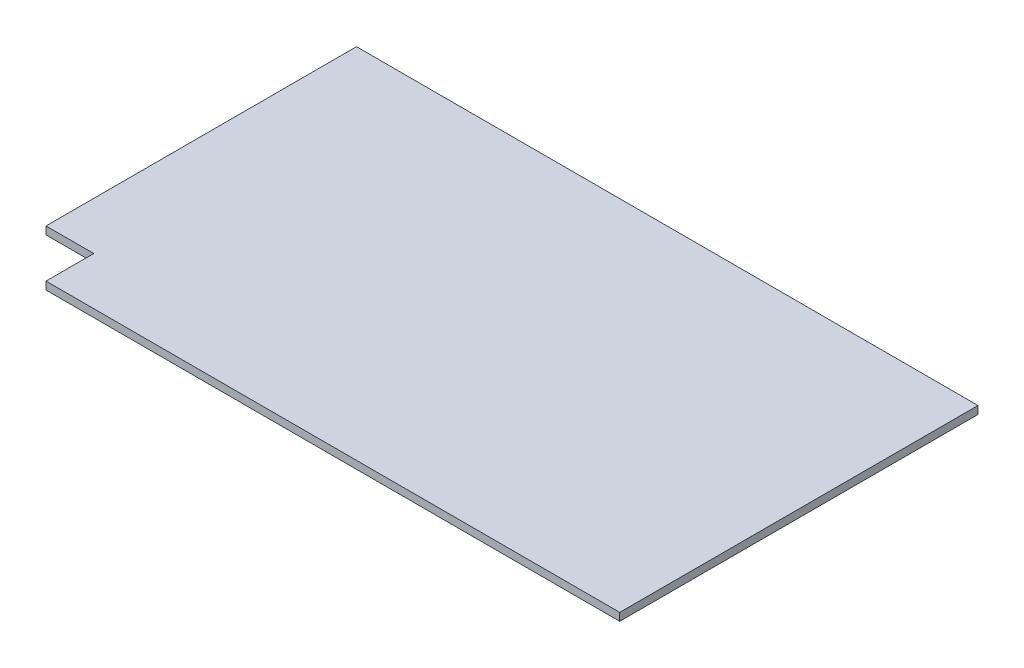
ISO-10303-21;
HEADER;
FILE_DESCRIPTION(('STEP AP214'),'2;1');
FILE_NAME('part.step','',(''),(''),'','','');
FILE_SCHEMA(('AUTOMOTIVE_DESIGN { 1 0 10303 214 1 1 1 1 }'));
ENDSEC;
DATA;
#1=APPLICATION_CONTEXT('core data for automotive mechanical design processes');
#2=APPLICATION_PROTOCOL_DEFINITION('international standard','automotive_design',2000,#1);
#3=PRODUCT_CONTEXT('',#1,'mechanical');
#4=PRODUCT('Part','Part','',(#3));
#5=PRODUCT_RELATED_PRODUCT_CATEGORY('part','',(#4));
#6=PRODUCT_DEFINITION_FORMATION('','',#4);
#7=PRODUCT_DEFINITION_CONTEXT('part definition',#1,'design');
#8=PRODUCT_DEFINITION('design','',#6,#7);
#9=PRODUCT_DEFINITION_SHAPE('','',#8);
#10=(LENGTH_UNIT() NAMED_UNIT(*) SI_UNIT(.MILLI.,.METRE.));
#11=(NAMED_UNIT(*) PLANE_ANGLE_UNIT() SI_UNIT($,.RADIAN.));
#12=(NAMED_UNIT(*) SI_UNIT($,.STERADIAN.) SOLID_ANGLE_UNIT());
#13=UNCERTAINTY_MEASURE_WITH_UNIT(LENGTH_MEASURE(1.E-05),#10,'distance_accuracy_value','');
#14=(GEOMETRIC_REPRESENTATION_CONTEXT(3) GLOBAL_UNCERTAINTY_ASSIGNED_CONTEXT((#13)) GLOBAL_UNIT_ASSIGNED_CONTEXT((#10,
#11,#12)) REPRESENTATION_CONTEXT('',''));
#15=CARTESIAN_POINT('',(0.,0.,0.));
#16=DIRECTION('',(0.,0.,1.));
#17=DIRECTION('',(1.,0.,0.));
#18=AXIS2_PLACEMENT_3D('',#15,#16,#17);
#19=CARTESIAN_POINT('',(-750.,15.,1250.));
#20=DIRECTION('',(1.,0.,0.));
#21=DIRECTION('',(0.,0.,-1.));
#22=AXIS2_PLACEMENT_3D('',#19,#20,#21);
#23=PLANE('',#22);
#24=DIRECTION('',(0.,0.,1.));
#25=VECTOR('',#24,1.);
#26=CARTESIAN_POINT('',(-750.,0.,1250.));
#27=LINE('',#26,#25);
#28=CARTESIAN_POINT('',(-750.,0.,560.));
#29=VERTEX_POINT('',#28);
#30=CARTESIAN_POINT('',(-750.,0.,1158.));
#31=VERTEX_POINT('',#30);
#32=EDGE_CURVE('E108',#29,#31,#27,.T.);
#33=ORIENTED_EDGE('',*,*,#32,.T.);
#34=DIRECTION('',(0.,1.,0.));
#35=VECTOR('',#34,1.);
#36=CARTESIAN_POINT('',(-750.,0.,1158.));
#37=LINE('',#36,#35);
#38=CARTESIAN_POINT('',(-750.,15.,1158.));
#39=VERTEX_POINT('',#38);
#40=EDGE_CURVE('E129',#31,#39,#37,.T.);
#41=ORIENTED_EDGE('',*,*,#40,.T.);
#42=DIRECTION('',(0.,0.,1.));
#43=VECTOR('',#42,1.);
#44=CARTESIAN_POINT('',(-750.,15.,1250.));
#45=LINE('',#44,#43);
#46=CARTESIAN_POINT('',(-750.,15.,560.));
#47=VERTEX_POINT('',#46);
#48=EDGE_CURVE('E42',#47,#39,#45,.T.);
#49=ORIENTED_EDGE('',*,*,#48,.F.);
#50=DIRECTION('',(0.,1.,0.));
#51=VECTOR('',#50,1.);
#52=CARTESIAN_POINT('',(-750.,0.,560.));
#53=LINE('',#52,#51);
#54=EDGE_CURVE('E124',#29,#47,#53,.T.);
#55=ORIENTED_EDGE('',*,*,#54,.F.);
#56=EDGE_LOOP('',(#33,#41,#49,#55));
#57=FACE_BOUND('',#56,.T.);
#58=ADVANCED_FACE('F34',(#57),#23,.F.);
#59=CARTESIAN_POINT('',(-750.,15.,1250.));
#60=DIRECTION('',(0.,0.,-1.));
#61=DIRECTION('',(-1.,0.,0.));
#62=AXIS2_PLACEMENT_3D('',#59,#60,#61);
#63=PLANE('',#62);
#64=DIRECTION('',(1.,0.,0.));
#65=VECTOR('',#64,1.);
#66=CARTESIAN_POINT('',(-750.,15.,1250.));
#67=LINE('',#66,#65);
#68=CARTESIAN_POINT('',(-658.,15.,1250.));
#69=VERTEX_POINT('',#68);
#70=CARTESIAN_POINT('',(447.,15.,1250.));
#71=VERTEX_POINT('',#70);
#72=EDGE_CURVE('E11',#69,#71,#67,.T.);
#73=ORIENTED_EDGE('',*,*,#72,.F.);
#74=DIRECTION('',(0.,1.,0.));
#75=VECTOR('',#74,1.);
#76=CARTESIAN_POINT('',(-658.,0.,1250.));
#77=LINE('',#76,#75);
#78=CARTESIAN_POINT('',(-658.,0.,1250.));
#79=VERTEX_POINT('',#78);
#80=EDGE_CURVE('E90',#79,#69,#77,.T.);
#81=ORIENTED_EDGE('',*,*,#80,.F.);
#82=DIRECTION('',(1.,0.,0.));
#83=VECTOR('',#82,1.);
#84=CARTESIAN_POINT('',(-750.,0.,1250.));
#85=LINE('',#84,#83);
#86=CARTESIAN_POINT('',(447.,0.,1250.));
#87=VERTEX_POINT('',#86);
#88=EDGE_CURVE('E37',#79,#87,#85,.T.);
#89=ORIENTED_EDGE('',*,*,#88,.T.);
#90=DIRECTION('',(0.,1.,0.));
#91=VECTOR('',#90,1.);
#92=CARTESIAN_POINT('',(447.,0.,1250.));
#93=LINE('',#92,#91);
#94=EDGE_CURVE('E112',#87,#71,#93,.T.);
#95=ORIENTED_EDGE('',*,*,#94,.T.);
#96=EDGE_LOOP('',(#73,#81,#89,#95));
#97=FACE_BOUND('',#96,.T.);
#98=ADVANCED_FACE('F99',(#97),#63,.F.);
#99=CARTESIAN_POINT('',(0.,15.,0.));
#100=DIRECTION('',(0.,-1.,0.));
#101=DIRECTION('',(0.,0.,-1.));
#102=AXIS2_PLACEMENT_3D('',#99,#100,#101);
#103=PLANE('',#102);
#104=ORIENTED_EDGE('',*,*,#48,.T.);
#105=DIRECTION('',(-1.,0.,0.));
#106=VECTOR('',#105,1.);
#107=CARTESIAN_POINT('',(-750.,15.,1158.));
#108=LINE('',#107,#106);
#109=CARTESIAN_POINT('',(-658.,15.,1158.));
#110=VERTEX_POINT('',#109);
#111=EDGE_CURVE('E95',#110,#39,#108,.T.);
#112=ORIENTED_EDGE('',*,*,#111,.F.);
#113=DIRECTION('',(0.,0.,-1.));
#114=VECTOR('',#113,1.);
#115=CARTESIAN_POINT('',(-658.,15.,1250.));
#116=LINE('',#115,#114);
#117=EDGE_CURVE('E134',#69,#110,#116,.T.);
#118=ORIENTED_EDGE('',*,*,#117,.F.);
#119=ORIENTED_EDGE('',*,*,#72,.T.);
#120=DIRECTION('',(0.,0.,1.));
#121=VECTOR('',#120,1.);
#122=CARTESIAN_POINT('',(447.,15.,-1150.));
#123=LINE('',#122,#121);
#124=CARTESIAN_POINT('',(447.,15.,560.000000000001));
#125=VERTEX_POINT('',#124);
#126=EDGE_CURVE('E119',#125,#71,#123,.T.);
#127=ORIENTED_EDGE('',*,*,#126,.F.);
#128=DIRECTION('',(1.,0.,0.));
#129=VECTOR('',#128,1.);
#130=CARTESIAN_POINT('',(-750.,15.,560.));
#131=LINE('',#130,#129);
#132=EDGE_CURVE('E58',#47,#125,#131,.T.);
#133=ORIENTED_EDGE('',*,*,#132,.F.);
#134=EDGE_LOOP('',(#104,#112,#118,#119,#127,#133));
#135=FACE_BOUND('',#134,.T.);
#136=ADVANCED_FACE('F140',(#135),#103,.F.);
#137=CARTESIAN_POINT('',(0.,0.,0.));
#138=DIRECTION('',(0.,-1.,0.));
#139=DIRECTION('',(0.,0.,-1.));
#140=AXIS2_PLACEMENT_3D('',#137,#138,#139);
#141=PLANE('',#140);
#142=DIRECTION('',(-1.,0.,0.));
#143=VECTOR('',#142,1.);
#144=CARTESIAN_POINT('',(-750.,0.,1158.));
#145=LINE('',#144,#143);
#146=CARTESIAN_POINT('',(-658.,0.,1158.));
#147=VERTEX_POINT('',#146);
#148=EDGE_CURVE('E50',#147,#31,#145,.T.);
#149=ORIENTED_EDGE('',*,*,#148,.T.);
#150=ORIENTED_EDGE('',*,*,#32,.F.);
#151=DIRECTION('',(1.,0.,0.));
#152=VECTOR('',#151,1.);
#153=CARTESIAN_POINT('',(-750.,0.,560.));
#154=LINE('',#153,#152);
#155=CARTESIAN_POINT('',(447.,0.,560.));
#156=VERTEX_POINT('',#155);
#157=EDGE_CURVE('E126',#29,#156,#154,.T.);
#158=ORIENTED_EDGE('',*,*,#157,.T.);
#159=DIRECTION('',(0.,0.,1.));
#160=VECTOR('',#159,1.);
#161=CARTESIAN_POINT('',(447.,0.,-1150.));
#162=LINE('',#161,#160);
#163=EDGE_CURVE('E106',#156,#87,#162,.T.);
#164=ORIENTED_EDGE('',*,*,#163,.T.);
#165=ORIENTED_EDGE('',*,*,#88,.F.);
#166=DIRECTION('',(0.,0.,-1.));
#167=VECTOR('',#166,1.);
#168=CARTESIAN_POINT('',(-658.,0.,1250.));
#169=LINE('',#168,#167);
#170=EDGE_CURVE('E86',#79,#147,#169,.T.);
#171=ORIENTED_EDGE('',*,*,#170,.T.);
#172=EDGE_LOOP('',(#149,#150,#158,#164,#165,#171));
#173=FACE_BOUND('',#172,.T.);
#174=ADVANCED_FACE('F103',(#173),#141,.T.);
#175=CARTESIAN_POINT('',(447.,0.,-1150.));
#176=DIRECTION('',(-1.,0.,0.));
#177=DIRECTION('',(0.,0.,1.));
#178=AXIS2_PLACEMENT_3D('',#175,#176,#177);
#179=PLANE('',#178);
#180=ORIENTED_EDGE('',*,*,#163,.F.);
#181=DIRECTION('',(0.,1.,0.));
#182=VECTOR('',#181,1.);
#183=CARTESIAN_POINT('',(447.,0.,560.));
#184=LINE('',#183,#182);
#185=EDGE_CURVE('E122',#156,#125,#184,.T.);
#186=ORIENTED_EDGE('',*,*,#185,.T.);
#187=ORIENTED_EDGE('',*,*,#126,.T.);
#188=ORIENTED_EDGE('',*,*,#94,.F.);
#189=EDGE_LOOP('',(#180,#186,#187,#188));
#190=FACE_BOUND('',#189,.T.);
#191=ADVANCED_FACE('F137',(#190),#179,.F.);
#192=CARTESIAN_POINT('',(-750.,0.,560.));
#193=DIRECTION('',(0.,0.,1.));
#194=DIRECTION('',(1.,0.,0.));
#195=AXIS2_PLACEMENT_3D('',#192,#193,#194);
#196=PLANE('',#195);
#197=ORIENTED_EDGE('',*,*,#132,.T.);
#198=ORIENTED_EDGE('',*,*,#185,.F.);
#199=ORIENTED_EDGE('',*,*,#157,.F.);
#200=ORIENTED_EDGE('',*,*,#54,.T.);
#201=EDGE_LOOP('',(#197,#198,#199,#200));
#202=FACE_BOUND('',#201,.T.);
#203=ADVANCED_FACE('F144',(#202),#196,.F.);
#204=CARTESIAN_POINT('',(-750.,0.,1158.));
#205=DIRECTION('',(0.,0.,-1.));
#206=DIRECTION('',(-1.,0.,0.));
#207=AXIS2_PLACEMENT_3D('',#204,#205,#206);
#208=PLANE('',#207);
#209=ORIENTED_EDGE('',*,*,#111,.T.);
#210=ORIENTED_EDGE('',*,*,#40,.F.);
#211=ORIENTED_EDGE('',*,*,#148,.F.);
#212=DIRECTION('',(0.,1.,0.));
#213=VECTOR('',#212,1.);
#214=CARTESIAN_POINT('',(-658.,0.,1158.));
#215=LINE('',#214,#213);
#216=EDGE_CURVE('E92',#147,#110,#215,.T.);
#217=ORIENTED_EDGE('',*,*,#216,.T.);
#218=EDGE_LOOP('',(#209,#210,#211,#217));
#219=FACE_BOUND('',#218,.T.);
#220=ADVANCED_FACE('F143',(#219),#208,.F.);
#221=CARTESIAN_POINT('',(-658.,0.,1250.));
#222=DIRECTION('',(1.,0.,0.));
#223=DIRECTION('',(0.,0.,-1.));
#224=AXIS2_PLACEMENT_3D('',#221,#222,#223);
#225=PLANE('',#224);
#226=ORIENTED_EDGE('',*,*,#117,.T.);
#227=ORIENTED_EDGE('',*,*,#216,.F.);
#228=ORIENTED_EDGE('',*,*,#170,.F.);
#229=ORIENTED_EDGE('',*,*,#80,.T.);
#230=EDGE_LOOP('',(#226,#227,#228,#229));
#231=FACE_BOUND('',#230,.T.);
#232=ADVANCED_FACE('F89',(#231),#225,.F.);
#233=CLOSED_SHELL('',(#58,#98,#136,#174,#191,#203,#220,#232));
#234=MANIFOLD_SOLID_BREP('B2',#233);
#235=ADVANCED_BREP_SHAPE_REPRESENTATION('',(#18,#234),#14);
#236=SHAPE_DEFINITION_REPRESENTATION(#9,#235);
ENDSEC;
END-ISO-10303-21;
